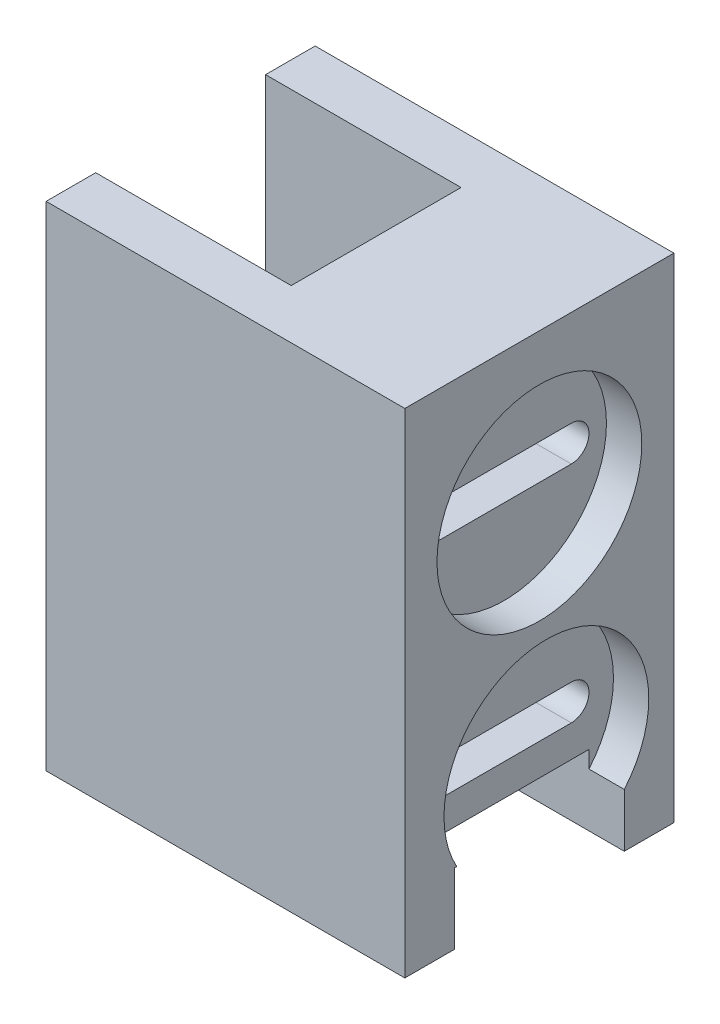
ISO-10303-21;
HEADER;
FILE_DESCRIPTION(('STEP AP214'),'2;1');
FILE_NAME('part.step','',(''),(''),'','','');
FILE_SCHEMA(('AUTOMOTIVE_DESIGN { 1 0 10303 214 1 1 1 1 }'));
ENDSEC;
DATA;
#1=APPLICATION_CONTEXT('core data for automotive mechanical design processes');
#2=APPLICATION_PROTOCOL_DEFINITION('international standard','automotive_design',2000,#1);
#3=PRODUCT_CONTEXT('',#1,'mechanical');
#4=PRODUCT('Part','Part','',(#3));
#5=PRODUCT_RELATED_PRODUCT_CATEGORY('part','',(#4));
#6=PRODUCT_DEFINITION_FORMATION('','',#4);
#7=PRODUCT_DEFINITION_CONTEXT('part definition',#1,'design');
#8=PRODUCT_DEFINITION('design','',#6,#7);
#9=PRODUCT_DEFINITION_SHAPE('','',#8);
#10=(LENGTH_UNIT() NAMED_UNIT(*) SI_UNIT(.MILLI.,.METRE.));
#11=(NAMED_UNIT(*) PLANE_ANGLE_UNIT() SI_UNIT($,.RADIAN.));
#12=(NAMED_UNIT(*) SI_UNIT($,.STERADIAN.) SOLID_ANGLE_UNIT());
#13=UNCERTAINTY_MEASURE_WITH_UNIT(LENGTH_MEASURE(1.E-05),#10,'distance_accuracy_value','');
#14=(GEOMETRIC_REPRESENTATION_CONTEXT(3) GLOBAL_UNCERTAINTY_ASSIGNED_CONTEXT((#13)) GLOBAL_UNIT_ASSIGNED_CONTEXT((#10,
#11,#12)) REPRESENTATION_CONTEXT('',''));
#15=CARTESIAN_POINT('',(0.,0.,0.));
#16=DIRECTION('',(0.,0.,1.));
#17=DIRECTION('',(1.,0.,0.));
#18=AXIS2_PLACEMENT_3D('',#15,#16,#17);
#19=CARTESIAN_POINT('',(0.,13.97,0.));
#20=DIRECTION('',(1.,0.,0.));
#21=DIRECTION('',(0.,0.,-1.));
#22=AXIS2_PLACEMENT_3D('',#19,#20,#21);
#23=PLANE('',#22);
#24=DIRECTION('',(0.,-1.,0.));
#25=VECTOR('',#24,1.);
#26=CARTESIAN_POINT('',(0.,6.985,-6.215));
#27=LINE('',#26,#25);
#28=CARTESIAN_POINT('',(0.,13.97,-6.215));
#29=VERTEX_POINT('',#28);
#30=CARTESIAN_POINT('',(0.,0.,-6.215));
#31=VERTEX_POINT('',#30);
#32=EDGE_CURVE('E273',#29,#31,#27,.T.);
#33=ORIENTED_EDGE('',*,*,#32,.F.);
#34=DIRECTION('',(0.,0.,1.));
#35=VECTOR('',#34,1.);
#36=CARTESIAN_POINT('',(0.,13.97,0.));
#37=LINE('',#36,#35);
#38=CARTESIAN_POINT('',(0.,13.97,-7.62));
#39=VERTEX_POINT('',#38);
#40=EDGE_CURVE('E350',#39,#29,#37,.T.);
#41=ORIENTED_EDGE('',*,*,#40,.F.);
#42=DIRECTION('',(0.,-1.,0.));
#43=VECTOR('',#42,1.);
#44=CARTESIAN_POINT('',(0.,13.97,-7.62));
#45=LINE('',#44,#43);
#46=CARTESIAN_POINT('',(0.,0.,-7.62));
#47=VERTEX_POINT('',#46);
#48=EDGE_CURVE('E360',#39,#47,#45,.T.);
#49=ORIENTED_EDGE('',*,*,#48,.T.);
#50=DIRECTION('',(0.,0.,1.));
#51=VECTOR('',#50,1.);
#52=CARTESIAN_POINT('',(0.,0.,0.));
#53=LINE('',#52,#51);
#54=EDGE_CURVE('E361',#47,#31,#53,.T.);
#55=ORIENTED_EDGE('',*,*,#54,.T.);
#56=EDGE_LOOP('',(#33,#41,#49,#55));
#57=FACE_BOUND('',#56,.T.);
#58=ADVANCED_FACE('F33',(#57),#23,.F.);
#59=CARTESIAN_POINT('',(-0.000999999999999265,2.9,-16.3288728911858));
#60=DIRECTION('',(0.,-1.,0.));
#61=DIRECTION('',(0.,0.,-1.));
#62=AXIS2_PLACEMENT_3D('',#59,#60,#61);
#63=PLANE('',#62);
#64=DIRECTION('',(0.,0.,-1.));
#65=VECTOR('',#64,1.);
#66=CARTESIAN_POINT('',(5.5372,2.9,-16.3288728911858));
#67=LINE('',#66,#65);
#68=CARTESIAN_POINT('',(5.5372,2.9,-1.905));
#69=VERTEX_POINT('',#68);
#70=CARTESIAN_POINT('',(5.5372,2.9,-5.715));
#71=VERTEX_POINT('',#70);
#72=EDGE_CURVE('E220',#69,#71,#67,.T.);
#73=ORIENTED_EDGE('',*,*,#72,.F.);
#74=DIRECTION('',(1.,0.,0.));
#75=VECTOR('',#74,1.);
#76=CARTESIAN_POINT('',(-0.000999999999999265,2.9,-1.905));
#77=LINE('',#76,#75);
#78=CARTESIAN_POINT('',(9.16,2.9,-1.905));
#79=VERTEX_POINT('',#78);
#80=EDGE_CURVE('E218',#69,#79,#77,.T.);
#81=ORIENTED_EDGE('',*,*,#80,.T.);
#82=DIRECTION('',(0.,0.,1.));
#83=VECTOR('',#82,1.);
#84=CARTESIAN_POINT('',(9.16,2.9,-16.3288728911858));
#85=LINE('',#84,#83);
#86=CARTESIAN_POINT('',(9.16,2.9,-5.715));
#87=VERTEX_POINT('',#86);
#88=EDGE_CURVE('E304',#87,#79,#85,.T.);
#89=ORIENTED_EDGE('',*,*,#88,.F.);
#90=DIRECTION('',(1.,0.,0.));
#91=VECTOR('',#90,1.);
#92=CARTESIAN_POINT('',(-0.000999999999999265,2.9,-5.715));
#93=LINE('',#92,#91);
#94=EDGE_CURVE('E307',#71,#87,#93,.T.);
#95=ORIENTED_EDGE('',*,*,#94,.F.);
#96=EDGE_LOOP('',(#73,#81,#89,#95));
#97=FACE_BOUND('',#96,.T.);
#98=ADVANCED_FACE('F447',(#97),#63,.F.);
#99=CARTESIAN_POINT('',(-0.000999999999999265,2.,-16.3288728911858));
#100=DIRECTION('',(0.,-1.,0.));
#101=DIRECTION('',(0.,0.,-1.));
#102=AXIS2_PLACEMENT_3D('',#99,#100,#101);
#103=PLANE('',#102);
#104=DIRECTION('',(1.,0.,0.));
#105=VECTOR('',#104,1.);
#106=CARTESIAN_POINT('',(-0.000999999999999265,2.,-1.405));
#107=LINE('',#106,#105);
#108=CARTESIAN_POINT('',(5.5372,2.,-1.405));
#109=VERTEX_POINT('',#108);
#110=CARTESIAN_POINT('',(10.16,2.,-1.405));
#111=VERTEX_POINT('',#110);
#112=EDGE_CURVE('E285',#109,#111,#107,.T.);
#113=ORIENTED_EDGE('',*,*,#112,.F.);
#114=DIRECTION('',(0.,0.,-1.));
#115=VECTOR('',#114,1.);
#116=CARTESIAN_POINT('',(5.5372,2.,-16.3288728911858));
#117=LINE('',#116,#115);
#118=CARTESIAN_POINT('',(5.5372,2.,-6.215));
#119=VERTEX_POINT('',#118);
#120=EDGE_CURVE('E200',#109,#119,#117,.T.);
#121=ORIENTED_EDGE('',*,*,#120,.T.);
#122=DIRECTION('',(1.,0.,0.));
#123=VECTOR('',#122,1.);
#124=CARTESIAN_POINT('',(-0.000999999999999265,2.,-6.215));
#125=LINE('',#124,#123);
#126=CARTESIAN_POINT('',(9.16,2.,-6.215));
#127=VERTEX_POINT('',#126);
#128=EDGE_CURVE('E286',#119,#127,#125,.T.);
#129=ORIENTED_EDGE('',*,*,#128,.T.);
#130=DIRECTION('',(0.,0.,1.));
#131=VECTOR('',#130,1.);
#132=CARTESIAN_POINT('',(9.16,2.,-16.3288728911858));
#133=LINE('',#132,#131);
#134=CARTESIAN_POINT('',(9.16,2.,-1.4689315914574));
#135=VERTEX_POINT('',#134);
#136=EDGE_CURVE('E275',#127,#135,#133,.T.);
#137=ORIENTED_EDGE('',*,*,#136,.T.);
#138=DIRECTION('',(1.,0.,0.));
#139=VECTOR('',#138,1.);
#140=CARTESIAN_POINT('',(9.16,2.,-1.4689315914574));
#141=LINE('',#140,#139);
#142=CARTESIAN_POINT('',(10.16,2.,-1.4689315914574));
#143=VERTEX_POINT('',#142);
#144=EDGE_CURVE('E270',#143,#135,#141,.F.);
#145=ORIENTED_EDGE('',*,*,#144,.F.);
#146=DIRECTION('',(0.,0.,-1.));
#147=VECTOR('',#146,1.);
#148=CARTESIAN_POINT('',(10.16,2.,-16.3288728911858));
#149=LINE('',#148,#147);
#150=EDGE_CURVE('E277',#111,#143,#149,.T.);
#151=ORIENTED_EDGE('',*,*,#150,.F.);
#152=EDGE_LOOP('',(#113,#121,#129,#137,#145,#151));
#153=FACE_BOUND('',#152,.T.);
#154=ADVANCED_FACE('F453',(#153),#103,.T.);
#155=CARTESIAN_POINT('',(0.,0.,-7.62));
#156=DIRECTION('',(0.,-1.,0.));
#157=DIRECTION('',(0.,0.,-1.));
#158=AXIS2_PLACEMENT_3D('',#155,#156,#157);
#159=PLANE('',#158);
#160=CARTESIAN_POINT('',(0.,0.,-1.405));
#161=VERTEX_POINT('',#160);
#162=CARTESIAN_POINT('',(0.,0.,0.));
#163=VERTEX_POINT('',#162);
#164=EDGE_CURVE('E347',#161,#163,#53,.T.);
#165=ORIENTED_EDGE('',*,*,#164,.F.);
#166=DIRECTION('',(1.,0.,0.));
#167=VECTOR('',#166,1.);
#168=CARTESIAN_POINT('',(-0.000999999999999265,0.,-1.405));
#169=LINE('',#168,#167);
#170=CARTESIAN_POINT('',(10.16,0.,-1.405));
#171=VERTEX_POINT('',#170);
#172=EDGE_CURVE('E291',#161,#171,#169,.T.);
#173=ORIENTED_EDGE('',*,*,#172,.T.);
#174=DIRECTION('',(0.,0.,-1.));
#175=VECTOR('',#174,1.);
#176=CARTESIAN_POINT('',(10.16,0.,0.));
#177=LINE('',#176,#175);
#178=CARTESIAN_POINT('',(10.16,0.,0.));
#179=VERTEX_POINT('',#178);
#180=EDGE_CURVE('E367',#179,#171,#177,.T.);
#181=ORIENTED_EDGE('',*,*,#180,.F.);
#182=DIRECTION('',(1.,0.,0.));
#183=VECTOR('',#182,1.);
#184=CARTESIAN_POINT('',(0.,0.,0.));
#185=LINE('',#184,#183);
#186=EDGE_CURVE('E364',#163,#179,#185,.T.);
#187=ORIENTED_EDGE('',*,*,#186,.F.);
#188=EDGE_LOOP('',(#165,#173,#181,#187));
#189=FACE_BOUND('',#188,.T.);
#190=ADVANCED_FACE('F391',(#189),#159,.T.);
#191=CARTESIAN_POINT('',(9.16,3.4,-4.00861661129746));
#192=DIRECTION('',(1.,0.,0.));
#193=DIRECTION('',(0.,0.,-1.));
#194=AXIS2_PLACEMENT_3D('',#191,#192,#193);
#195=CYLINDRICAL_SURFACE('',#194,2.9);
#196=ORIENTED_EDGE('',*,*,#144,.T.);
#197=CARTESIAN_POINT('',(9.16,3.4,-4.00861661129746));
#198=DIRECTION('',(1.,0.,0.));
#199=DIRECTION('',(0.,0.,-1.));
#200=AXIS2_PLACEMENT_3D('',#197,#198,#199);
#201=CIRCLE('',#200,2.9);
#202=CARTESIAN_POINT('',(9.16,1.51801372426431,-6.215));
#203=VERTEX_POINT('',#202);
#204=EDGE_CURVE('E344',#203,#135,#201,.T.);
#205=ORIENTED_EDGE('',*,*,#204,.F.);
#206=DIRECTION('',(1.,0.,0.));
#207=VECTOR('',#206,1.);
#208=CARTESIAN_POINT('',(9.16,1.51801372426431,-6.215));
#209=LINE('',#208,#207);
#210=CARTESIAN_POINT('',(10.16,1.51801372426431,-6.215));
#211=VERTEX_POINT('',#210);
#212=EDGE_CURVE('E55',#211,#203,#209,.F.);
#213=ORIENTED_EDGE('',*,*,#212,.F.);
#214=CARTESIAN_POINT('',(10.16,3.4,-4.00861661129746));
#215=DIRECTION('',(1.,0.,0.));
#216=DIRECTION('',(0.,0.,-1.));
#217=AXIS2_PLACEMENT_3D('',#214,#215,#216);
#218=CIRCLE('',#217,2.9);
#219=EDGE_CURVE('E341',#211,#143,#218,.T.);
#220=ORIENTED_EDGE('',*,*,#219,.T.);
#221=EDGE_LOOP('',(#196,#205,#213,#220));
#222=FACE_BOUND('',#221,.T.);
#223=ADVANCED_FACE('F458',(#222),#195,.F.);
#224=CARTESIAN_POINT('',(9.16,3.4,-4.00861661129746));
#225=DIRECTION('',(1.,0.,0.));
#226=DIRECTION('',(0.,0.,-1.));
#227=AXIS2_PLACEMENT_3D('',#224,#225,#226);
#228=PLANE('',#227);
#229=ORIENTED_EDGE('',*,*,#88,.T.);
#230=CARTESIAN_POINT('',(9.16,3.4,-1.905));
#231=DIRECTION('',(1.,0.,0.));
#232=DIRECTION('',(0.,0.,-1.));
#233=AXIS2_PLACEMENT_3D('',#230,#231,#232);
#234=CIRCLE('',#233,0.5);
#235=CARTESIAN_POINT('',(9.16,3.9,-1.905));
#236=VERTEX_POINT('',#235);
#237=EDGE_CURVE('E301',#79,#236,#234,.F.);
#238=ORIENTED_EDGE('',*,*,#237,.T.);
#239=DIRECTION('',(0.,0.,1.));
#240=VECTOR('',#239,1.);
#241=CARTESIAN_POINT('',(9.16,3.9,-16.3288728911858));
#242=LINE('',#241,#240);
#243=CARTESIAN_POINT('',(9.16,3.9,-5.715));
#244=VERTEX_POINT('',#243);
#245=EDGE_CURVE('E298',#244,#236,#242,.T.);
#246=ORIENTED_EDGE('',*,*,#245,.F.);
#247=CARTESIAN_POINT('',(9.16,3.4,-5.715));
#248=DIRECTION('',(1.,0.,0.));
#249=DIRECTION('',(0.,0.,-1.));
#250=AXIS2_PLACEMENT_3D('',#247,#248,#249);
#251=CIRCLE('',#250,0.5);
#252=EDGE_CURVE('E309',#244,#87,#251,.F.);
#253=ORIENTED_EDGE('',*,*,#252,.T.);
#254=EDGE_LOOP('',(#229,#238,#246,#253));
#255=FACE_BOUND('',#254,.T.);
#256=ORIENTED_EDGE('',*,*,#204,.T.);
#257=ORIENTED_EDGE('',*,*,#136,.F.);
#258=DIRECTION('',(0.,-1.,0.));
#259=VECTOR('',#258,1.);
#260=CARTESIAN_POINT('',(9.16,6.985,-6.215));
#261=LINE('',#260,#259);
#262=EDGE_CURVE('E296',#127,#203,#261,.T.);
#263=ORIENTED_EDGE('',*,*,#262,.T.);
#264=EDGE_LOOP('',(#256,#257,#263));
#265=FACE_BOUND('',#264,.T.);
#266=ADVANCED_FACE('F443',(#255,#265),#228,.T.);
#267=CARTESIAN_POINT('',(0.,13.97,-1.405));
#268=VERTEX_POINT('',#267);
#269=CARTESIAN_POINT('',(0.,13.97,0.));
#270=VERTEX_POINT('',#269);
#271=EDGE_CURVE('E354',#268,#270,#37,.T.);
#272=ORIENTED_EDGE('',*,*,#271,.F.);
#273=DIRECTION('',(0.,-1.,0.));
#274=VECTOR('',#273,1.);
#275=CARTESIAN_POINT('',(0.,6.985,-1.405));
#276=LINE('',#275,#274);
#277=EDGE_CURVE('E288',#268,#161,#276,.T.);
#278=ORIENTED_EDGE('',*,*,#277,.T.);
#279=ORIENTED_EDGE('',*,*,#164,.T.);
#280=DIRECTION('',(0.,-1.,0.));
#281=VECTOR('',#280,1.);
#282=CARTESIAN_POINT('',(0.,13.97,0.));
#283=LINE('',#282,#281);
#284=EDGE_CURVE('E41',#270,#163,#283,.T.);
#285=ORIENTED_EDGE('',*,*,#284,.F.);
#286=EDGE_LOOP('',(#272,#278,#279,#285));
#287=FACE_BOUND('',#286,.T.);
#288=ADVANCED_FACE('F35',(#287),#23,.F.);
#289=CARTESIAN_POINT('',(9.16,9.75,-3.81));
#290=DIRECTION('',(1.,0.,0.));
#291=DIRECTION('',(0.,0.,-1.));
#292=AXIS2_PLACEMENT_3D('',#289,#290,#291);
#293=PLANE('',#292);
#294=CARTESIAN_POINT('',(9.16,9.75,-3.81));
#295=DIRECTION('',(1.,0.,0.));
#296=DIRECTION('',(0.,0.,-1.));
#297=AXIS2_PLACEMENT_3D('',#294,#295,#296);
#298=CIRCLE('',#297,2.9);
#299=CARTESIAN_POINT('',(9.16,9.75,-6.71));
#300=VERTEX_POINT('',#299);
#301=EDGE_CURVE('E338',#300,#300,#298,.T.);
#302=ORIENTED_EDGE('',*,*,#301,.T.);
#303=EDGE_LOOP('',(#302));
#304=FACE_BOUND('',#303,.T.);
#305=CARTESIAN_POINT('',(9.16,9.75,-1.905));
#306=DIRECTION('',(1.,0.,0.));
#307=DIRECTION('',(0.,0.,-1.));
#308=AXIS2_PLACEMENT_3D('',#305,#306,#307);
#309=CIRCLE('',#308,0.5);
#310=CARTESIAN_POINT('',(9.16,9.25,-1.905));
#311=VERTEX_POINT('',#310);
#312=CARTESIAN_POINT('',(9.16,10.25,-1.905));
#313=VERTEX_POINT('',#312);
#314=EDGE_CURVE('E329',#311,#313,#309,.F.);
#315=ORIENTED_EDGE('',*,*,#314,.T.);
#316=DIRECTION('',(0.,0.,1.));
#317=VECTOR('',#316,1.);
#318=CARTESIAN_POINT('',(9.16,10.25,-16.3288728911858));
#319=LINE('',#318,#317);
#320=CARTESIAN_POINT('',(9.16,10.25,-5.715));
#321=VERTEX_POINT('',#320);
#322=EDGE_CURVE('E323',#321,#313,#319,.T.);
#323=ORIENTED_EDGE('',*,*,#322,.F.);
#324=CARTESIAN_POINT('',(9.16,9.75,-5.715));
#325=DIRECTION('',(1.,0.,0.));
#326=DIRECTION('',(0.,0.,-1.));
#327=AXIS2_PLACEMENT_3D('',#324,#325,#326);
#328=CIRCLE('',#327,0.5);
#329=CARTESIAN_POINT('',(9.16,9.25,-5.715));
#330=VERTEX_POINT('',#329);
#331=EDGE_CURVE('E320',#321,#330,#328,.F.);
#332=ORIENTED_EDGE('',*,*,#331,.T.);
#333=DIRECTION('',(0.,0.,1.));
#334=VECTOR('',#333,1.);
#335=CARTESIAN_POINT('',(9.16,9.25,-16.3288728911858));
#336=LINE('',#335,#334);
#337=EDGE_CURVE('E317',#330,#311,#336,.T.);
#338=ORIENTED_EDGE('',*,*,#337,.T.);
#339=EDGE_LOOP('',(#315,#323,#332,#338));
#340=FACE_BOUND('',#339,.T.);
#341=ADVANCED_FACE('F418',(#304,#340),#293,.T.);
#342=CARTESIAN_POINT('',(0.,13.97,0.));
#343=DIRECTION('',(0.,0.,-1.));
#344=DIRECTION('',(-1.,0.,0.));
#345=AXIS2_PLACEMENT_3D('',#342,#343,#344);
#346=PLANE('',#345);
#347=ORIENTED_EDGE('',*,*,#186,.T.);
#348=DIRECTION('',(0.,-1.,0.));
#349=VECTOR('',#348,1.);
#350=CARTESIAN_POINT('',(10.16,13.97,0.));
#351=LINE('',#350,#349);
#352=CARTESIAN_POINT('',(10.16,13.97,0.));
#353=VERTEX_POINT('',#352);
#354=EDGE_CURVE('E377',#353,#179,#351,.T.);
#355=ORIENTED_EDGE('',*,*,#354,.F.);
#356=DIRECTION('',(1.,0.,0.));
#357=VECTOR('',#356,1.);
#358=CARTESIAN_POINT('',(0.,13.97,0.));
#359=LINE('',#358,#357);
#360=EDGE_CURVE('E353',#270,#353,#359,.T.);
#361=ORIENTED_EDGE('',*,*,#360,.F.);
#362=ORIENTED_EDGE('',*,*,#284,.T.);
#363=EDGE_LOOP('',(#347,#355,#361,#362));
#364=FACE_BOUND('',#363,.T.);
#365=ADVANCED_FACE('F383',(#364),#346,.F.);
#366=CARTESIAN_POINT('',(10.16,13.97,0.));
#367=DIRECTION('',(-1.,0.,0.));
#368=DIRECTION('',(0.,0.,1.));
#369=AXIS2_PLACEMENT_3D('',#366,#367,#368);
#370=PLANE('',#369);
#371=CARTESIAN_POINT('',(10.16,9.75,-3.81));
#372=DIRECTION('',(1.,0.,0.));
#373=DIRECTION('',(0.,0.,-1.));
#374=AXIS2_PLACEMENT_3D('',#371,#372,#373);
#375=CIRCLE('',#374,2.9);
#376=CARTESIAN_POINT('',(10.16,9.75,-6.71));
#377=VERTEX_POINT('',#376);
#378=EDGE_CURVE('E337',#377,#377,#375,.T.);
#379=ORIENTED_EDGE('',*,*,#378,.F.);
#380=EDGE_LOOP('',(#379));
#381=FACE_BOUND('',#380,.T.);
#382=ORIENTED_EDGE('',*,*,#219,.F.);
#383=DIRECTION('',(0.,1.,0.));
#384=VECTOR('',#383,1.);
#385=CARTESIAN_POINT('',(10.16,6.985,-6.215));
#386=LINE('',#385,#384);
#387=CARTESIAN_POINT('',(10.16,0.,-6.215));
#388=VERTEX_POINT('',#387);
#389=EDGE_CURVE('E283',#388,#211,#386,.T.);
#390=ORIENTED_EDGE('',*,*,#389,.F.);
#391=CARTESIAN_POINT('',(10.16,0.,-7.62));
#392=VERTEX_POINT('',#391);
#393=EDGE_CURVE('E366',#388,#392,#177,.T.);
#394=ORIENTED_EDGE('',*,*,#393,.T.);
#395=DIRECTION('',(0.,-1.,0.));
#396=VECTOR('',#395,1.);
#397=CARTESIAN_POINT('',(10.16,13.97,-7.62));
#398=LINE('',#397,#396);
#399=CARTESIAN_POINT('',(10.16,13.97,-7.62));
#400=VERTEX_POINT('',#399);
#401=EDGE_CURVE('E374',#400,#392,#398,.T.);
#402=ORIENTED_EDGE('',*,*,#401,.F.);
#403=DIRECTION('',(0.,0.,-1.));
#404=VECTOR('',#403,1.);
#405=CARTESIAN_POINT('',(10.16,13.97,0.));
#406=LINE('',#405,#404);
#407=EDGE_CURVE('E356',#353,#400,#406,.T.);
#408=ORIENTED_EDGE('',*,*,#407,.F.);
#409=ORIENTED_EDGE('',*,*,#354,.T.);
#410=ORIENTED_EDGE('',*,*,#180,.T.);
#411=DIRECTION('',(0.,1.,0.));
#412=VECTOR('',#411,1.);
#413=CARTESIAN_POINT('',(10.16,6.985,-1.405));
#414=LINE('',#413,#412);
#415=EDGE_CURVE('E280',#171,#111,#414,.T.);
#416=ORIENTED_EDGE('',*,*,#415,.T.);
#417=ORIENTED_EDGE('',*,*,#150,.T.);
#418=EDGE_LOOP('',(#382,#390,#394,#402,#408,#409,#410,#416,#417));
#419=FACE_BOUND('',#418,.T.);
#420=ADVANCED_FACE('F395',(#381,#419),#370,.F.);
#421=CARTESIAN_POINT('',(0.,13.97,-7.62));
#422=DIRECTION('',(0.,0.,1.));
#423=DIRECTION('',(1.,0.,0.));
#424=AXIS2_PLACEMENT_3D('',#421,#422,#423);
#425=PLANE('',#424);
#426=DIRECTION('',(-1.,0.,0.));
#427=VECTOR('',#426,1.);
#428=CARTESIAN_POINT('',(0.,0.,-7.62));
#429=LINE('',#428,#427);
#430=EDGE_CURVE('E370',#392,#47,#429,.T.);
#431=ORIENTED_EDGE('',*,*,#430,.T.);
#432=ORIENTED_EDGE('',*,*,#48,.F.);
#433=DIRECTION('',(-1.,0.,0.));
#434=VECTOR('',#433,1.);
#435=CARTESIAN_POINT('',(0.,13.97,-7.62));
#436=LINE('',#435,#434);
#437=EDGE_CURVE('E358',#400,#39,#436,.T.);
#438=ORIENTED_EDGE('',*,*,#437,.F.);
#439=ORIENTED_EDGE('',*,*,#401,.T.);
#440=EDGE_LOOP('',(#431,#432,#438,#439));
#441=FACE_BOUND('',#440,.T.);
#442=ADVANCED_FACE('F467',(#441),#425,.F.);
#443=CARTESIAN_POINT('',(0.,13.97,-7.62));
#444=DIRECTION('',(0.,-1.,0.));
#445=DIRECTION('',(0.,0.,-1.));
#446=AXIS2_PLACEMENT_3D('',#443,#444,#445);
#447=PLANE('',#446);
#448=ORIENTED_EDGE('',*,*,#40,.T.);
#449=DIRECTION('',(-1.,0.,0.));
#450=VECTOR('',#449,1.);
#451=CARTESIAN_POINT('',(5.5372,13.97,-6.215));
#452=LINE('',#451,#450);
#453=CARTESIAN_POINT('',(5.5372,13.97,-6.215));
#454=VERTEX_POINT('',#453);
#455=EDGE_CURVE('E255',#454,#29,#452,.T.);
#456=ORIENTED_EDGE('',*,*,#455,.F.);
#457=DIRECTION('',(0.,0.,-1.));
#458=VECTOR('',#457,1.);
#459=CARTESIAN_POINT('',(5.5372,13.97,-6.215));
#460=LINE('',#459,#458);
#461=CARTESIAN_POINT('',(5.5372,13.97,-1.405));
#462=VERTEX_POINT('',#461);
#463=EDGE_CURVE('E251',#462,#454,#460,.T.);
#464=ORIENTED_EDGE('',*,*,#463,.F.);
#465=DIRECTION('',(-1.,0.,0.));
#466=VECTOR('',#465,1.);
#467=CARTESIAN_POINT('',(5.5372,13.97,-1.405));
#468=LINE('',#467,#466);
#469=EDGE_CURVE('E258',#462,#268,#468,.T.);
#470=ORIENTED_EDGE('',*,*,#469,.T.);
#471=ORIENTED_EDGE('',*,*,#271,.T.);
#472=ORIENTED_EDGE('',*,*,#360,.T.);
#473=ORIENTED_EDGE('',*,*,#407,.T.);
#474=ORIENTED_EDGE('',*,*,#437,.T.);
#475=EDGE_LOOP('',(#448,#456,#464,#470,#471,#472,#473,#474));
#476=FACE_BOUND('',#475,.T.);
#477=ADVANCED_FACE('F400',(#476),#447,.F.);
#478=DIRECTION('',(1.,0.,0.));
#479=VECTOR('',#478,1.);
#480=CARTESIAN_POINT('',(-0.000999999999999265,0.,-6.215));
#481=LINE('',#480,#479);
#482=EDGE_CURVE('E289',#31,#388,#481,.T.);
#483=ORIENTED_EDGE('',*,*,#482,.F.);
#484=ORIENTED_EDGE('',*,*,#54,.F.);
#485=ORIENTED_EDGE('',*,*,#430,.F.);
#486=ORIENTED_EDGE('',*,*,#393,.F.);
#487=EDGE_LOOP('',(#483,#484,#485,#486));
#488=FACE_BOUND('',#487,.T.);
#489=ADVANCED_FACE('F464',(#488),#159,.T.);
#490=CARTESIAN_POINT('',(9.16,9.75,-3.81));
#491=DIRECTION('',(1.,0.,0.));
#492=DIRECTION('',(0.,0.,-1.));
#493=AXIS2_PLACEMENT_3D('',#490,#491,#492);
#494=CYLINDRICAL_SURFACE('',#493,2.9);
#495=ORIENTED_EDGE('',*,*,#301,.F.);
#496=EDGE_LOOP('',(#495));
#497=FACE_BOUND('',#496,.T.);
#498=ORIENTED_EDGE('',*,*,#378,.T.);
#499=EDGE_LOOP('',(#498));
#500=FACE_BOUND('',#499,.T.);
#501=ADVANCED_FACE('F488',(#497,#500),#494,.F.);
#502=CARTESIAN_POINT('',(-0.000999999999999265,10.25,-16.3288728911858));
#503=DIRECTION('',(0.,-1.,0.));
#504=DIRECTION('',(0.,0.,-1.));
#505=AXIS2_PLACEMENT_3D('',#502,#503,#504);
#506=PLANE('',#505);
#507=DIRECTION('',(0.,0.,1.));
#508=VECTOR('',#507,1.);
#509=CARTESIAN_POINT('',(5.5372,10.25,-16.3288728911858));
#510=LINE('',#509,#508);
#511=CARTESIAN_POINT('',(5.5372,10.25,-5.715));
#512=VERTEX_POINT('',#511);
#513=CARTESIAN_POINT('',(5.5372,10.25,-1.905));
#514=VERTEX_POINT('',#513);
#515=EDGE_CURVE('E48',#512,#514,#510,.T.);
#516=ORIENTED_EDGE('',*,*,#515,.F.);
#517=DIRECTION('',(1.,0.,0.));
#518=VECTOR('',#517,1.);
#519=CARTESIAN_POINT('',(-0.000999999999999265,10.25,-5.715));
#520=LINE('',#519,#518);
#521=EDGE_CURVE('E327',#512,#321,#520,.T.);
#522=ORIENTED_EDGE('',*,*,#521,.T.);
#523=ORIENTED_EDGE('',*,*,#322,.T.);
#524=DIRECTION('',(1.,0.,0.));
#525=VECTOR('',#524,1.);
#526=CARTESIAN_POINT('',(-0.000999999999999265,10.25,-1.905));
#527=LINE('',#526,#525);
#528=EDGE_CURVE('E326',#514,#313,#527,.T.);
#529=ORIENTED_EDGE('',*,*,#528,.F.);
#530=EDGE_LOOP('',(#516,#522,#523,#529));
#531=FACE_BOUND('',#530,.T.);
#532=ADVANCED_FACE('F413',(#531),#506,.T.);
#533=CARTESIAN_POINT('',(-0.000999999999999265,9.75,-5.715));
#534=DIRECTION('',(1.,0.,0.));
#535=DIRECTION('',(0.,0.,-1.));
#536=AXIS2_PLACEMENT_3D('',#533,#534,#535);
#537=CYLINDRICAL_SURFACE('',#536,0.5);
#538=DIRECTION('',(-1.,0.,0.));
#539=VECTOR('',#538,1.);
#540=CARTESIAN_POINT('',(5.5372,9.75,-6.215));
#541=LINE('',#540,#539);
#542=CARTESIAN_POINT('',(5.5372,9.75,-6.215));
#543=VERTEX_POINT('',#542);
#544=CARTESIAN_POINT('',(2.9972,9.75,-6.215));
#545=VERTEX_POINT('',#544);
#546=EDGE_CURVE('E254',#543,#545,#541,.T.);
#547=ORIENTED_EDGE('',*,*,#546,.T.);
#548=CARTESIAN_POINT('',(2.9972,9.75,-5.715));
#549=DIRECTION('',(1.,0.,0.));
#550=DIRECTION('',(0.,0.,-1.));
#551=AXIS2_PLACEMENT_3D('',#548,#549,#550);
#552=CIRCLE('',#551,0.5);
#553=CARTESIAN_POINT('',(2.9972,9.25,-5.715));
#554=VERTEX_POINT('',#553);
#555=EDGE_CURVE('E242',#545,#554,#552,.F.);
#556=ORIENTED_EDGE('',*,*,#555,.T.);
#557=DIRECTION('',(1.,0.,0.));
#558=VECTOR('',#557,1.);
#559=CARTESIAN_POINT('',(-0.000999999999999265,9.25,-5.715));
#560=LINE('',#559,#558);
#561=EDGE_CURVE('E330',#554,#330,#560,.T.);
#562=ORIENTED_EDGE('',*,*,#561,.T.);
#563=ORIENTED_EDGE('',*,*,#331,.F.);
#564=ORIENTED_EDGE('',*,*,#521,.F.);
#565=CARTESIAN_POINT('',(5.5372,9.75,-5.715));
#566=DIRECTION('',(1.,0.,0.));
#567=DIRECTION('',(0.,0.,-1.));
#568=AXIS2_PLACEMENT_3D('',#565,#566,#567);
#569=CIRCLE('',#568,0.5);
#570=EDGE_CURVE('E266',#512,#543,#569,.F.);
#571=ORIENTED_EDGE('',*,*,#570,.T.);
#572=EDGE_LOOP('',(#547,#556,#562,#563,#564,#571));
#573=FACE_BOUND('',#572,.T.);
#574=ADVANCED_FACE('F427',(#573),#537,.F.);
#575=CARTESIAN_POINT('',(-0.000999999999999265,9.25,-16.3288728911858));
#576=DIRECTION('',(0.,-1.,0.));
#577=DIRECTION('',(0.,0.,-1.));
#578=AXIS2_PLACEMENT_3D('',#575,#576,#577);
#579=PLANE('',#578);
#580=ORIENTED_EDGE('',*,*,#561,.F.);
#581=DIRECTION('',(0.,0.,1.));
#582=VECTOR('',#581,1.);
#583=CARTESIAN_POINT('',(2.9972,9.25,-16.3288728911858));
#584=LINE('',#583,#582);
#585=CARTESIAN_POINT('',(2.9972,9.25,-1.905));
#586=VERTEX_POINT('',#585);
#587=EDGE_CURVE('E239',#554,#586,#584,.T.);
#588=ORIENTED_EDGE('',*,*,#587,.T.);
#589=DIRECTION('',(1.,0.,0.));
#590=VECTOR('',#589,1.);
#591=CARTESIAN_POINT('',(-0.000999999999999265,9.25,-1.905));
#592=LINE('',#591,#590);
#593=EDGE_CURVE('E332',#586,#311,#592,.T.);
#594=ORIENTED_EDGE('',*,*,#593,.T.);
#595=ORIENTED_EDGE('',*,*,#337,.F.);
#596=EDGE_LOOP('',(#580,#588,#594,#595));
#597=FACE_BOUND('',#596,.T.);
#598=ADVANCED_FACE('F422',(#597),#579,.F.);
#599=CARTESIAN_POINT('',(-0.000999999999999265,9.75,-1.905));
#600=DIRECTION('',(1.,0.,0.));
#601=DIRECTION('',(0.,0.,-1.));
#602=AXIS2_PLACEMENT_3D('',#599,#600,#601);
#603=CYLINDRICAL_SURFACE('',#602,0.5);
#604=ORIENTED_EDGE('',*,*,#593,.F.);
#605=CARTESIAN_POINT('',(2.9972,9.75,-1.905));
#606=DIRECTION('',(1.,0.,0.));
#607=DIRECTION('',(0.,0.,-1.));
#608=AXIS2_PLACEMENT_3D('',#605,#606,#607);
#609=CIRCLE('',#608,0.5);
#610=CARTESIAN_POINT('',(2.9972,9.75,-1.405));
#611=VERTEX_POINT('',#610);
#612=EDGE_CURVE('E236',#586,#611,#609,.F.);
#613=ORIENTED_EDGE('',*,*,#612,.T.);
#614=DIRECTION('',(-1.,0.,0.));
#615=VECTOR('',#614,1.);
#616=CARTESIAN_POINT('',(5.5372,9.75,-1.405));
#617=LINE('',#616,#615);
#618=CARTESIAN_POINT('',(5.5372,9.75,-1.405));
#619=VERTEX_POINT('',#618);
#620=EDGE_CURVE('E261',#619,#611,#617,.T.);
#621=ORIENTED_EDGE('',*,*,#620,.F.);
#622=CARTESIAN_POINT('',(5.5372,9.75,-1.905));
#623=DIRECTION('',(1.,0.,0.));
#624=DIRECTION('',(0.,0.,-1.));
#625=AXIS2_PLACEMENT_3D('',#622,#623,#624);
#626=CIRCLE('',#625,0.5);
#627=EDGE_CURVE('E11',#619,#514,#626,.F.);
#628=ORIENTED_EDGE('',*,*,#627,.T.);
#629=ORIENTED_EDGE('',*,*,#528,.T.);
#630=ORIENTED_EDGE('',*,*,#314,.F.);
#631=EDGE_LOOP('',(#604,#613,#621,#628,#629,#630));
#632=FACE_BOUND('',#631,.T.);
#633=ADVANCED_FACE('F410',(#632),#603,.F.);
#634=CARTESIAN_POINT('',(-0.000999999999999265,3.4,-1.905));
#635=DIRECTION('',(1.,0.,0.));
#636=DIRECTION('',(0.,0.,-1.));
#637=AXIS2_PLACEMENT_3D('',#634,#635,#636);
#638=CYLINDRICAL_SURFACE('',#637,0.5);
#639=CARTESIAN_POINT('',(5.5372,3.4,-1.905));
#640=DIRECTION('',(-1.,0.,0.));
#641=DIRECTION('',(0.,0.,1.));
#642=AXIS2_PLACEMENT_3D('',#639,#640,#641);
#643=CIRCLE('',#642,0.5);
#644=CARTESIAN_POINT('',(5.5372,3.4,-1.405));
#645=VERTEX_POINT('',#644);
#646=EDGE_CURVE('E197',#645,#69,#643,.F.);
#647=ORIENTED_EDGE('',*,*,#646,.F.);
#648=DIRECTION('',(-1.,0.,0.));
#649=VECTOR('',#648,1.);
#650=CARTESIAN_POINT('',(5.5372,3.4,-1.405));
#651=LINE('',#650,#649);
#652=CARTESIAN_POINT('',(2.9972,3.4,-1.405));
#653=VERTEX_POINT('',#652);
#654=EDGE_CURVE('E203',#645,#653,#651,.T.);
#655=ORIENTED_EDGE('',*,*,#654,.T.);
#656=CARTESIAN_POINT('',(2.9972,3.4,-1.905));
#657=DIRECTION('',(1.,0.,0.));
#658=DIRECTION('',(0.,0.,-1.));
#659=AXIS2_PLACEMENT_3D('',#656,#657,#658);
#660=CIRCLE('',#659,0.5);
#661=CARTESIAN_POINT('',(2.9972,3.9,-1.905));
#662=VERTEX_POINT('',#661);
#663=EDGE_CURVE('E234',#653,#662,#660,.F.);
#664=ORIENTED_EDGE('',*,*,#663,.T.);
#665=DIRECTION('',(1.,0.,0.));
#666=VECTOR('',#665,1.);
#667=CARTESIAN_POINT('',(-0.000999999999999265,3.9,-1.905));
#668=LINE('',#667,#666);
#669=EDGE_CURVE('E310',#662,#236,#668,.T.);
#670=ORIENTED_EDGE('',*,*,#669,.T.);
#671=ORIENTED_EDGE('',*,*,#237,.F.);
#672=ORIENTED_EDGE('',*,*,#80,.F.);
#673=EDGE_LOOP('',(#647,#655,#664,#670,#671,#672));
#674=FACE_BOUND('',#673,.T.);
#675=ADVANCED_FACE('F216',(#674),#638,.F.);
#676=CARTESIAN_POINT('',(-0.000999999999999265,3.9,-16.3288728911858));
#677=DIRECTION('',(0.,-1.,0.));
#678=DIRECTION('',(0.,0.,-1.));
#679=AXIS2_PLACEMENT_3D('',#676,#677,#678);
#680=PLANE('',#679);
#681=DIRECTION('',(0.,0.,1.));
#682=VECTOR('',#681,1.);
#683=CARTESIAN_POINT('',(2.9972,3.9,-16.3288728911858));
#684=LINE('',#683,#682);
#685=CARTESIAN_POINT('',(2.9972,3.9,-5.715));
#686=VERTEX_POINT('',#685);
#687=EDGE_CURVE('E232',#686,#662,#684,.T.);
#688=ORIENTED_EDGE('',*,*,#687,.F.);
#689=DIRECTION('',(1.,0.,0.));
#690=VECTOR('',#689,1.);
#691=CARTESIAN_POINT('',(-0.000999999999999265,3.9,-5.715));
#692=LINE('',#691,#690);
#693=EDGE_CURVE('E312',#686,#244,#692,.T.);
#694=ORIENTED_EDGE('',*,*,#693,.T.);
#695=ORIENTED_EDGE('',*,*,#245,.T.);
#696=ORIENTED_EDGE('',*,*,#669,.F.);
#697=EDGE_LOOP('',(#688,#694,#695,#696));
#698=FACE_BOUND('',#697,.T.);
#699=ADVANCED_FACE('F439',(#698),#680,.T.);
#700=CARTESIAN_POINT('',(-0.000999999999999265,3.4,-5.715));
#701=DIRECTION('',(1.,0.,0.));
#702=DIRECTION('',(0.,0.,-1.));
#703=AXIS2_PLACEMENT_3D('',#700,#701,#702);
#704=CYLINDRICAL_SURFACE('',#703,0.5);
#705=CARTESIAN_POINT('',(2.9972,3.4,-5.715));
#706=DIRECTION('',(1.,0.,0.));
#707=DIRECTION('',(0.,0.,-1.));
#708=AXIS2_PLACEMENT_3D('',#705,#706,#707);
#709=CIRCLE('',#708,0.5);
#710=CARTESIAN_POINT('',(2.9972,3.4,-6.215));
#711=VERTEX_POINT('',#710);
#712=EDGE_CURVE('E229',#686,#711,#709,.F.);
#713=ORIENTED_EDGE('',*,*,#712,.T.);
#714=DIRECTION('',(-1.,0.,0.));
#715=VECTOR('',#714,1.);
#716=CARTESIAN_POINT('',(5.5372,3.4,-6.215));
#717=LINE('',#716,#715);
#718=CARTESIAN_POINT('',(5.5372,3.4,-6.215));
#719=VERTEX_POINT('',#718);
#720=EDGE_CURVE('E213',#719,#711,#717,.T.);
#721=ORIENTED_EDGE('',*,*,#720,.F.);
#722=CARTESIAN_POINT('',(5.5372,3.4,-5.715));
#723=DIRECTION('',(-1.,0.,0.));
#724=DIRECTION('',(0.,0.,1.));
#725=AXIS2_PLACEMENT_3D('',#722,#723,#724);
#726=CIRCLE('',#725,0.5);
#727=EDGE_CURVE('E224',#71,#719,#726,.F.);
#728=ORIENTED_EDGE('',*,*,#727,.F.);
#729=ORIENTED_EDGE('',*,*,#94,.T.);
#730=ORIENTED_EDGE('',*,*,#252,.F.);
#731=ORIENTED_EDGE('',*,*,#693,.F.);
#732=EDGE_LOOP('',(#713,#721,#728,#729,#730,#731));
#733=FACE_BOUND('',#732,.T.);
#734=ADVANCED_FACE('F434',(#733),#704,.F.);
#735=CARTESIAN_POINT('',(-0.000999999999999265,6.985,-6.215));
#736=DIRECTION('',(0.,0.,-1.));
#737=DIRECTION('',(-1.,0.,0.));
#738=AXIS2_PLACEMENT_3D('',#735,#736,#737);
#739=PLANE('',#738);
#740=ORIENTED_EDGE('',*,*,#482,.T.);
#741=ORIENTED_EDGE('',*,*,#389,.T.);
#742=ORIENTED_EDGE('',*,*,#212,.T.);
#743=ORIENTED_EDGE('',*,*,#262,.F.);
#744=ORIENTED_EDGE('',*,*,#128,.F.);
#745=DIRECTION('',(0.,-1.,0.));
#746=VECTOR('',#745,1.);
#747=CARTESIAN_POINT('',(5.5372,3.4,-6.215));
#748=LINE('',#747,#746);
#749=EDGE_CURVE('E204',#719,#119,#748,.T.);
#750=ORIENTED_EDGE('',*,*,#749,.F.);
#751=ORIENTED_EDGE('',*,*,#720,.T.);
#752=DIRECTION('',(0.,-1.,0.));
#753=VECTOR('',#752,1.);
#754=CARTESIAN_POINT('',(2.9972,3.4,-6.215));
#755=LINE('',#754,#753);
#756=EDGE_CURVE('E219',#545,#711,#755,.T.);
#757=ORIENTED_EDGE('',*,*,#756,.F.);
#758=ORIENTED_EDGE('',*,*,#546,.F.);
#759=DIRECTION('',(0.,-1.,0.));
#760=VECTOR('',#759,1.);
#761=CARTESIAN_POINT('',(5.5372,9.75,-6.215));
#762=LINE('',#761,#760);
#763=EDGE_CURVE('E245',#454,#543,#762,.T.);
#764=ORIENTED_EDGE('',*,*,#763,.F.);
#765=ORIENTED_EDGE('',*,*,#455,.T.);
#766=ORIENTED_EDGE('',*,*,#32,.T.);
#767=EDGE_LOOP('',(#740,#741,#742,#743,#744,#750,#751,#757,#758,#764,#765,#766));
#768=FACE_BOUND('',#767,.T.);
#769=ADVANCED_FACE('F428',(#768),#739,.F.);
#770=CARTESIAN_POINT('',(-0.000999999999999265,6.985,-1.405));
#771=DIRECTION('',(0.,0.,-1.));
#772=DIRECTION('',(-1.,0.,0.));
#773=AXIS2_PLACEMENT_3D('',#770,#771,#772);
#774=PLANE('',#773);
#775=ORIENTED_EDGE('',*,*,#277,.F.);
#776=ORIENTED_EDGE('',*,*,#469,.F.);
#777=DIRECTION('',(0.,1.,0.));
#778=VECTOR('',#777,1.);
#779=CARTESIAN_POINT('',(5.5372,9.75,-1.405));
#780=LINE('',#779,#778);
#781=EDGE_CURVE('E248',#619,#462,#780,.T.);
#782=ORIENTED_EDGE('',*,*,#781,.F.);
#783=ORIENTED_EDGE('',*,*,#620,.T.);
#784=DIRECTION('',(0.,1.,0.));
#785=VECTOR('',#784,1.);
#786=CARTESIAN_POINT('',(2.9972,3.4,-1.405));
#787=LINE('',#786,#785);
#788=EDGE_CURVE('E209',#653,#611,#787,.T.);
#789=ORIENTED_EDGE('',*,*,#788,.F.);
#790=ORIENTED_EDGE('',*,*,#654,.F.);
#791=DIRECTION('',(0.,1.,0.));
#792=VECTOR('',#791,1.);
#793=CARTESIAN_POINT('',(5.5372,3.4,-1.405));
#794=LINE('',#793,#792);
#795=EDGE_CURVE('E193',#109,#645,#794,.T.);
#796=ORIENTED_EDGE('',*,*,#795,.F.);
#797=ORIENTED_EDGE('',*,*,#112,.T.);
#798=ORIENTED_EDGE('',*,*,#415,.F.);
#799=ORIENTED_EDGE('',*,*,#172,.F.);
#800=EDGE_LOOP('',(#775,#776,#782,#783,#789,#790,#796,#797,#798,#799));
#801=FACE_BOUND('',#800,.T.);
#802=ADVANCED_FACE('F207',(#801),#774,.T.);
#803=CARTESIAN_POINT('',(5.5372,13.97,-6.215));
#804=DIRECTION('',(1.,0.,0.));
#805=DIRECTION('',(0.,0.,-1.));
#806=AXIS2_PLACEMENT_3D('',#803,#804,#805);
#807=PLANE('',#806);
#808=ORIENTED_EDGE('',*,*,#515,.T.);
#809=ORIENTED_EDGE('',*,*,#627,.F.);
#810=ORIENTED_EDGE('',*,*,#781,.T.);
#811=ORIENTED_EDGE('',*,*,#463,.T.);
#812=ORIENTED_EDGE('',*,*,#763,.T.);
#813=ORIENTED_EDGE('',*,*,#570,.F.);
#814=EDGE_LOOP('',(#808,#809,#810,#811,#812,#813));
#815=FACE_BOUND('',#814,.T.);
#816=ADVANCED_FACE('F406',(#815),#807,.F.);
#817=CARTESIAN_POINT('',(2.9972,13.97,-6.215));
#818=DIRECTION('',(1.,0.,0.));
#819=DIRECTION('',(0.,0.,-1.));
#820=AXIS2_PLACEMENT_3D('',#817,#818,#819);
#821=PLANE('',#820);
#822=ORIENTED_EDGE('',*,*,#756,.T.);
#823=ORIENTED_EDGE('',*,*,#712,.F.);
#824=ORIENTED_EDGE('',*,*,#687,.T.);
#825=ORIENTED_EDGE('',*,*,#663,.F.);
#826=ORIENTED_EDGE('',*,*,#788,.T.);
#827=ORIENTED_EDGE('',*,*,#612,.F.);
#828=ORIENTED_EDGE('',*,*,#587,.F.);
#829=ORIENTED_EDGE('',*,*,#555,.F.);
#830=EDGE_LOOP('',(#822,#823,#824,#825,#826,#827,#828,#829));
#831=FACE_BOUND('',#830,.T.);
#832=ADVANCED_FACE('F424',(#831),#821,.F.);
#833=CARTESIAN_POINT('',(5.5372,0.,-6.215));
#834=DIRECTION('',(-1.,0.,0.));
#835=DIRECTION('',(0.,0.,1.));
#836=AXIS2_PLACEMENT_3D('',#833,#834,#835);
#837=PLANE('',#836);
#838=ORIENTED_EDGE('',*,*,#646,.T.);
#839=ORIENTED_EDGE('',*,*,#72,.T.);
#840=ORIENTED_EDGE('',*,*,#727,.T.);
#841=ORIENTED_EDGE('',*,*,#749,.T.);
#842=ORIENTED_EDGE('',*,*,#120,.F.);
#843=ORIENTED_EDGE('',*,*,#795,.T.);
#844=EDGE_LOOP('',(#838,#839,#840,#841,#842,#843));
#845=FACE_BOUND('',#844,.T.);
#846=ADVANCED_FACE('F195',(#845),#837,.T.);
#847=CLOSED_SHELL('',(#58,#98,#154,#190,#223,#266,#288,#341,#365,#420,#442,#477,#489,#501,#532,
#574,#598,#633,#675,#699,#734,#769,#802,#816,#832,#846));
#848=MANIFOLD_SOLID_BREP('B2',#847);
#849=ADVANCED_BREP_SHAPE_REPRESENTATION('',(#18,#848),#14);
#850=SHAPE_DEFINITION_REPRESENTATION(#9,#849);
ENDSEC;
END-ISO-10303-21;
